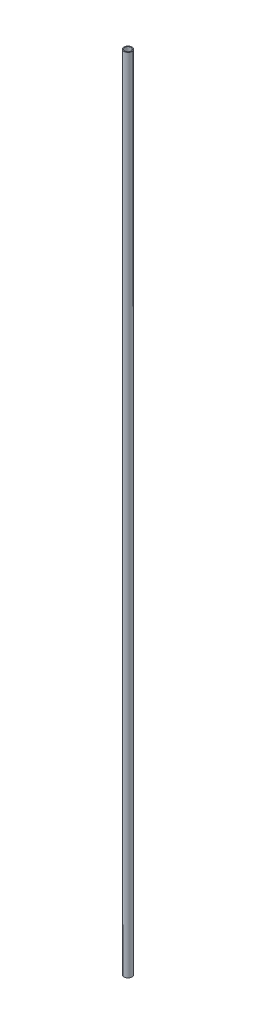
ISO-10303-21;
HEADER;
FILE_DESCRIPTION(('STEP AP214'),'2;1');
FILE_NAME('part.step','',(''),(''),'','','');
FILE_SCHEMA(('AUTOMOTIVE_DESIGN { 1 0 10303 214 1 1 1 1 }'));
ENDSEC;
DATA;
#1=APPLICATION_CONTEXT('core data for automotive mechanical design processes');
#2=APPLICATION_PROTOCOL_DEFINITION('international standard','automotive_design',2000,#1);
#3=PRODUCT_CONTEXT('',#1,'mechanical');
#4=PRODUCT('Part','Part','',(#3));
#5=PRODUCT_RELATED_PRODUCT_CATEGORY('part','',(#4));
#6=PRODUCT_DEFINITION_FORMATION('','',#4);
#7=PRODUCT_DEFINITION_CONTEXT('part definition',#1,'design');
#8=PRODUCT_DEFINITION('design','',#6,#7);
#9=PRODUCT_DEFINITION_SHAPE('','',#8);
#10=(LENGTH_UNIT() NAMED_UNIT(*) SI_UNIT(.MILLI.,.METRE.));
#11=(NAMED_UNIT(*) PLANE_ANGLE_UNIT() SI_UNIT($,.RADIAN.));
#12=(NAMED_UNIT(*) SI_UNIT($,.STERADIAN.) SOLID_ANGLE_UNIT());
#13=UNCERTAINTY_MEASURE_WITH_UNIT(LENGTH_MEASURE(1.E-05),#10,'distance_accuracy_value','');
#14=(GEOMETRIC_REPRESENTATION_CONTEXT(3) GLOBAL_UNCERTAINTY_ASSIGNED_CONTEXT((#13)) GLOBAL_UNIT_ASSIGNED_CONTEXT((#10,
#11,#12)) REPRESENTATION_CONTEXT('',''));
#15=CARTESIAN_POINT('',(0.,0.,0.));
#16=DIRECTION('',(0.,0.,1.));
#17=DIRECTION('',(1.,0.,0.));
#18=AXIS2_PLACEMENT_3D('',#15,#16,#17);
#19=CARTESIAN_POINT('',(0.,1020.,0.));
#20=DIRECTION('',(0.,1.,0.));
#21=DIRECTION('',(0.,0.,1.));
#22=AXIS2_PLACEMENT_3D('',#19,#20,#21);
#23=PLANE('',#22);
#24=CARTESIAN_POINT('',(0.,1020.,0.));
#25=DIRECTION('',(0.,1.,0.));
#26=DIRECTION('',(0.,0.,1.));
#27=AXIS2_PLACEMENT_3D('',#24,#25,#26);
#28=CIRCLE('',#27,5.);
#29=CARTESIAN_POINT('',(0.,1020.,5.));
#30=VERTEX_POINT('',#29);
#31=EDGE_CURVE('E10',#30,#30,#28,.T.);
#32=ORIENTED_EDGE('',*,*,#31,.T.);
#33=EDGE_LOOP('',(#32));
#34=FACE_BOUND('',#33,.T.);
#35=CARTESIAN_POINT('',(0.,1020.,0.));
#36=DIRECTION('',(0.,1.,0.));
#37=DIRECTION('',(0.,0.,1.));
#38=AXIS2_PLACEMENT_3D('',#35,#36,#37);
#39=CIRCLE('',#38,4.);
#40=CARTESIAN_POINT('',(0.,1020.,4.));
#41=VERTEX_POINT('',#40);
#42=EDGE_CURVE('E45',#41,#41,#39,.T.);
#43=ORIENTED_EDGE('',*,*,#42,.F.);
#44=EDGE_LOOP('',(#43));
#45=FACE_BOUND('',#44,.T.);
#46=ADVANCED_FACE('F34',(#34,#45),#23,.T.);
#47=CARTESIAN_POINT('',(0.,0.,0.));
#48=DIRECTION('',(0.,1.,0.));
#49=DIRECTION('',(0.,0.,1.));
#50=AXIS2_PLACEMENT_3D('',#47,#48,#49);
#51=PLANE('',#50);
#52=CARTESIAN_POINT('',(0.,0.,0.));
#53=DIRECTION('',(0.,1.,0.));
#54=DIRECTION('',(0.,0.,1.));
#55=AXIS2_PLACEMENT_3D('',#52,#53,#54);
#56=CIRCLE('',#55,5.);
#57=CARTESIAN_POINT('',(0.,0.,5.));
#58=VERTEX_POINT('',#57);
#59=EDGE_CURVE('E38',#58,#58,#56,.T.);
#60=ORIENTED_EDGE('',*,*,#59,.F.);
#61=EDGE_LOOP('',(#60));
#62=FACE_BOUND('',#61,.T.);
#63=CARTESIAN_POINT('',(0.,0.,0.));
#64=DIRECTION('',(0.,1.,0.));
#65=DIRECTION('',(0.,0.,1.));
#66=AXIS2_PLACEMENT_3D('',#63,#64,#65);
#67=CIRCLE('',#66,4.);
#68=CARTESIAN_POINT('',(0.,0.,4.));
#69=VERTEX_POINT('',#68);
#70=EDGE_CURVE('E47',#69,#69,#67,.T.);
#71=ORIENTED_EDGE('',*,*,#70,.T.);
#72=EDGE_LOOP('',(#71));
#73=FACE_BOUND('',#72,.T.);
#74=ADVANCED_FACE('F57',(#62,#73),#51,.F.);
#75=CARTESIAN_POINT('',(0.,1020.,0.));
#76=DIRECTION('',(0.,-1.,0.));
#77=DIRECTION('',(0.,0.,-1.));
#78=AXIS2_PLACEMENT_3D('',#75,#76,#77);
#79=CYLINDRICAL_SURFACE('',#78,5.);
#80=ORIENTED_EDGE('',*,*,#31,.F.);
#81=EDGE_LOOP('',(#80));
#82=FACE_BOUND('',#81,.T.);
#83=ORIENTED_EDGE('',*,*,#59,.T.);
#84=EDGE_LOOP('',(#83));
#85=FACE_BOUND('',#84,.T.);
#86=ADVANCED_FACE('F36',(#82,#85),#79,.T.);
#87=CARTESIAN_POINT('',(0.,1020.,0.));
#88=DIRECTION('',(0.,-1.,0.));
#89=DIRECTION('',(0.,0.,-1.));
#90=AXIS2_PLACEMENT_3D('',#87,#88,#89);
#91=CYLINDRICAL_SURFACE('',#90,4.);
#92=ORIENTED_EDGE('',*,*,#42,.T.);
#93=EDGE_LOOP('',(#92));
#94=FACE_BOUND('',#93,.T.);
#95=ORIENTED_EDGE('',*,*,#70,.F.);
#96=EDGE_LOOP('',(#95));
#97=FACE_BOUND('',#96,.T.);
#98=ADVANCED_FACE('F53',(#94,#97),#91,.F.);
#99=CLOSED_SHELL('',(#46,#74,#86,#98));
#100=MANIFOLD_SOLID_BREP('B2',#99);
#101=ADVANCED_BREP_SHAPE_REPRESENTATION('',(#18,#100),#14);
#102=SHAPE_DEFINITION_REPRESENTATION(#9,#101);
ENDSEC;
END-ISO-10303-21;
